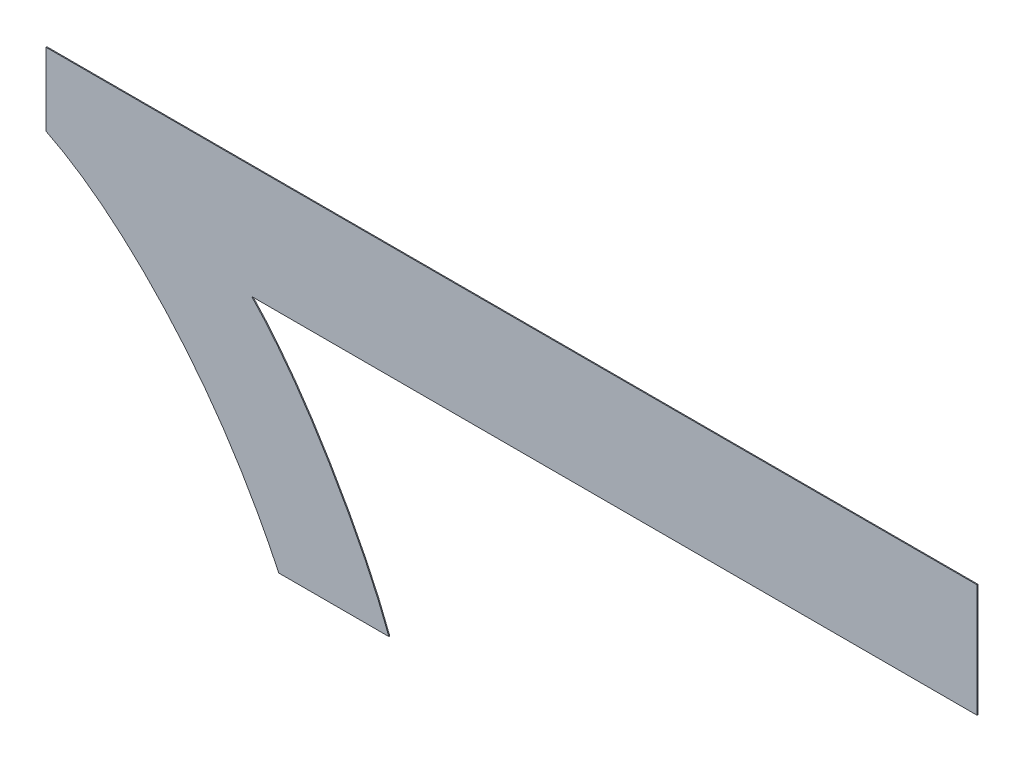
ISO-10303-21;
HEADER;
FILE_DESCRIPTION(('STEP AP214'),'2;1');
FILE_NAME('part.step','',(''),(''),'','','');
FILE_SCHEMA(('AUTOMOTIVE_DESIGN { 1 0 10303 214 1 1 1 1 }'));
ENDSEC;
DATA;
#1=APPLICATION_CONTEXT('core data for automotive mechanical design processes');
#2=APPLICATION_PROTOCOL_DEFINITION('international standard','automotive_design',2000,#1);
#3=PRODUCT_CONTEXT('',#1,'mechanical');
#4=PRODUCT('Part','Part','',(#3));
#5=PRODUCT_RELATED_PRODUCT_CATEGORY('part','',(#4));
#6=PRODUCT_DEFINITION_FORMATION('','',#4);
#7=PRODUCT_DEFINITION_CONTEXT('part definition',#1,'design');
#8=PRODUCT_DEFINITION('design','',#6,#7);
#9=PRODUCT_DEFINITION_SHAPE('','',#8);
#10=(LENGTH_UNIT() NAMED_UNIT(*) SI_UNIT(.MILLI.,.METRE.));
#11=(NAMED_UNIT(*) PLANE_ANGLE_UNIT() SI_UNIT($,.RADIAN.));
#12=(NAMED_UNIT(*) SI_UNIT($,.STERADIAN.) SOLID_ANGLE_UNIT());
#13=UNCERTAINTY_MEASURE_WITH_UNIT(LENGTH_MEASURE(1.E-05),#10,'distance_accuracy_value','');
#14=(GEOMETRIC_REPRESENTATION_CONTEXT(3) GLOBAL_UNCERTAINTY_ASSIGNED_CONTEXT((#13)) GLOBAL_UNIT_ASSIGNED_CONTEXT((#10,
#11,#12)) REPRESENTATION_CONTEXT('',''));
#15=CARTESIAN_POINT('',(0.,0.,0.));
#16=DIRECTION('',(0.,0.,1.));
#17=DIRECTION('',(1.,0.,0.));
#18=AXIS2_PLACEMENT_3D('',#15,#16,#17);
#19=CARTESIAN_POINT('',(25.9,-11.1374624319714,0.002));
#20=DIRECTION('',(-1.,0.,0.));
#21=DIRECTION('',(0.,0.,1.));
#22=AXIS2_PLACEMENT_3D('',#19,#20,#21);
#23=PLANE('',#22);
#24=CARTESIAN_POINT('',(25.9,-11.1374624319714,0.));
#25=CARTESIAN_POINT('',(25.9,-11.0562342620421,0.));
#26=CARTESIAN_POINT('',(25.9,-10.9750060921128,0.));
#27=CARTESIAN_POINT('',(25.9,-10.8937779221834,0.));
#28=B_SPLINE_CURVE_WITH_KNOTS('',3,(#24,#25,#26,#27),.UNSPECIFIED.,.F.,.F.,(4,4),(0.,
0.0450084687644281),.UNSPECIFIED.);
#29=CARTESIAN_POINT('',(25.9,-11.1374624319714,0.));
#30=VERTEX_POINT('',#29);
#31=CARTESIAN_POINT('',(25.9,-10.8937779221834,0.));
#32=VERTEX_POINT('',#31);
#33=EDGE_CURVE('E84',#30,#32,#28,.T.);
#34=ORIENTED_EDGE('',*,*,#33,.T.);
#35=DIRECTION('',(0.,0.,-1.));
#36=VECTOR('',#35,1.);
#37=CARTESIAN_POINT('',(25.9,-10.8937779221834,0.002));
#38=LINE('',#37,#36);
#39=CARTESIAN_POINT('',(25.9,-10.8937779221834,0.002));
#40=VERTEX_POINT('',#39);
#41=EDGE_CURVE('E93',#40,#32,#38,.T.);
#42=ORIENTED_EDGE('',*,*,#41,.F.);
#43=CARTESIAN_POINT('',(25.9,-11.1374624319714,0.002));
#44=CARTESIAN_POINT('',(25.9,-11.0562342620421,0.002));
#45=CARTESIAN_POINT('',(25.9,-10.9750060921128,0.002));
#46=CARTESIAN_POINT('',(25.9,-10.8937779221834,0.002));
#47=B_SPLINE_CURVE_WITH_KNOTS('',3,(#43,#44,#45,#46),.UNSPECIFIED.,.F.,.F.,(4,4),(0.,
0.0450084687644281),.UNSPECIFIED.);
#48=CARTESIAN_POINT('',(25.9,-11.1374624319714,0.002));
#49=VERTEX_POINT('',#48);
#50=EDGE_CURVE('E98',#49,#40,#47,.T.);
#51=ORIENTED_EDGE('',*,*,#50,.F.);
#52=DIRECTION('',(0.,0.,-1.));
#53=VECTOR('',#52,1.);
#54=CARTESIAN_POINT('',(25.9,-11.1374624319714,0.002));
#55=LINE('',#54,#53);
#56=EDGE_CURVE('E90',#49,#30,#55,.T.);
#57=ORIENTED_EDGE('',*,*,#56,.T.);
#58=EDGE_LOOP('',(#34,#42,#51,#57));
#59=FACE_BOUND('',#58,.T.);
#60=ADVANCED_FACE('F17',(#59),#23,.F.);
#61=CARTESIAN_POINT('',(25.9,-10.8937779221834,0.002));
#62=DIRECTION('',(0.,-1.,0.));
#63=DIRECTION('',(1.,0.,0.));
#64=AXIS2_PLACEMENT_3D('',#61,#62,#63);
#65=PLANE('',#64);
#66=CARTESIAN_POINT('',(25.9,-10.8937779221834,0.));
#67=CARTESIAN_POINT('',(25.2306050064797,-10.8937779221834,0.));
#68=CARTESIAN_POINT('',(24.5612100129595,-10.8937779221834,0.));
#69=CARTESIAN_POINT('',(23.8918150194393,-10.8937779221834,0.));
#70=B_SPLINE_CURVE_WITH_KNOTS('',3,(#66,#67,#68,#69),.UNSPECIFIED.,.F.,.F.,(4,4),
(0.0450084687644281,0.415919738747494),.UNSPECIFIED.);
#71=CARTESIAN_POINT('',(23.8918150194393,-10.8937779221834,0.));
#72=VERTEX_POINT('',#71);
#73=EDGE_CURVE('E81',#32,#72,#70,.T.);
#74=ORIENTED_EDGE('',*,*,#73,.T.);
#75=DIRECTION('',(0.,0.,-1.));
#76=VECTOR('',#75,1.);
#77=CARTESIAN_POINT('',(23.8918150194393,-10.8937779221834,0.002));
#78=LINE('',#77,#76);
#79=CARTESIAN_POINT('',(23.8918150194393,-10.8937779221834,0.002));
#80=VERTEX_POINT('',#79);
#81=EDGE_CURVE('E89',#80,#72,#78,.T.);
#82=ORIENTED_EDGE('',*,*,#81,.F.);
#83=CARTESIAN_POINT('',(25.9,-10.8937779221834,0.002));
#84=CARTESIAN_POINT('',(25.2306050064797,-10.8937779221834,0.002));
#85=CARTESIAN_POINT('',(24.5612100129595,-10.8937779221834,0.002));
#86=CARTESIAN_POINT('',(23.8918150194393,-10.8937779221834,0.002));
#87=B_SPLINE_CURVE_WITH_KNOTS('',3,(#83,#84,#85,#86),.UNSPECIFIED.,.F.,.F.,(4,4),
(0.0450084687644281,0.415919738747494),.UNSPECIFIED.);
#88=EDGE_CURVE('E75',#40,#80,#87,.T.);
#89=ORIENTED_EDGE('',*,*,#88,.F.);
#90=ORIENTED_EDGE('',*,*,#41,.T.);
#91=EDGE_LOOP('',(#74,#82,#89,#90));
#92=FACE_BOUND('',#91,.T.);
#93=ADVANCED_FACE('F94',(#92),#65,.F.);
#94=CARTESIAN_POINT('',(23.8918150194393,-10.8937779221834,0.002));
#95=DIRECTION('',(1.,0.,0.));
#96=DIRECTION('',(0.,0.,-1.));
#97=AXIS2_PLACEMENT_3D('',#94,#95,#96);
#98=PLANE('',#97);
#99=CARTESIAN_POINT('',(23.8918150194393,-10.8937779221834,0.));
#100=CARTESIAN_POINT('',(23.8918150194393,-10.9460347115046,0.));
#101=CARTESIAN_POINT('',(23.8918150194393,-10.9982915008258,0.));
#102=CARTESIAN_POINT('',(23.8918150194393,-11.050548290147,0.));
#103=B_SPLINE_CURVE_WITH_KNOTS('',3,(#99,#100,#101,#102),.UNSPECIFIED.,.F.,.F.,(4,4),
(0.415919738747494,0.44487518698465),.UNSPECIFIED.);
#104=CARTESIAN_POINT('',(23.8918150194393,-11.050548290147,0.));
#105=VERTEX_POINT('',#104);
#106=EDGE_CURVE('E86',#72,#105,#103,.T.);
#107=ORIENTED_EDGE('',*,*,#106,.T.);
#108=DIRECTION('',(0.,0.,-1.));
#109=VECTOR('',#108,1.);
#110=CARTESIAN_POINT('',(23.8918150194393,-11.050548290147,0.002));
#111=LINE('',#110,#109);
#112=CARTESIAN_POINT('',(23.8918150194393,-11.050548290147,0.002));
#113=VERTEX_POINT('',#112);
#114=EDGE_CURVE('E145',#113,#105,#111,.T.);
#115=ORIENTED_EDGE('',*,*,#114,.F.);
#116=CARTESIAN_POINT('',(23.8918150194393,-10.8937779221834,0.002));
#117=CARTESIAN_POINT('',(23.8918150194393,-10.9460347115046,0.002));
#118=CARTESIAN_POINT('',(23.8918150194393,-10.9982915008258,0.002));
#119=CARTESIAN_POINT('',(23.8918150194393,-11.050548290147,0.002));
#120=B_SPLINE_CURVE_WITH_KNOTS('',3,(#116,#117,#118,#119),.UNSPECIFIED.,.F.,.F.,(4,4),
(0.415919738747494,0.44487518698465),.UNSPECIFIED.);
#121=EDGE_CURVE('E149',#80,#113,#120,.T.);
#122=ORIENTED_EDGE('',*,*,#121,.F.);
#123=ORIENTED_EDGE('',*,*,#81,.T.);
#124=EDGE_LOOP('',(#107,#115,#122,#123));
#125=FACE_BOUND('',#124,.T.);
#126=ADVANCED_FACE('F199',(#125),#98,.F.);
#127=CARTESIAN_POINT('',(23.8918150194393,-11.050548290147,0.002));
#128=CARTESIAN_POINT('',(23.9781665643544,-11.0931930793599,0.002));
#129=CARTESIAN_POINT('',(24.0673828524657,-11.1650800097474,0.002));
#130=CARTESIAN_POINT('',(24.251159901586,-11.3693470578622,0.002));
#131=CARTESIAN_POINT('',(24.3293022304072,-11.4883681260661,0.002));
#132=CARTESIAN_POINT('',(24.3939635768365,-11.6248314515474,0.002));
#133=B_SPLINE_CURVE_WITH_KNOTS('',3,(#127,#128,#129,#130,#131,#132),.UNSPECIFIED.,.F.,.F.,(4,2,
4),(0.44487518698465,0.508874967384781,0.572607148923639),.UNSPECIFIED.);
#134=DIRECTION('',(0.,0.,-1.));
#135=VECTOR('',#134,1.);
#136=SURFACE_OF_LINEAR_EXTRUSION('',#133,#135);
#137=CARTESIAN_POINT('',(23.8918150194393,-11.050548290147,0.));
#138=CARTESIAN_POINT('',(23.9781665643544,-11.0931930793599,0.));
#139=CARTESIAN_POINT('',(24.0673828524657,-11.1650800097474,0.));
#140=CARTESIAN_POINT('',(24.251159901586,-11.3693470578622,0.));
#141=CARTESIAN_POINT('',(24.3293022304072,-11.4883681260661,0.));
#142=CARTESIAN_POINT('',(24.3939635768365,-11.6248314515474,0.));
#143=B_SPLINE_CURVE_WITH_KNOTS('',3,(#137,#138,#139,#140,#141,#142),.UNSPECIFIED.,.F.,.F.,(4,2,
4),(0.44487518698465,0.508874967384781,0.572607148923639),.UNSPECIFIED.);
#144=CARTESIAN_POINT('',(24.3939635768365,-11.6248314515474,0.));
#145=VERTEX_POINT('',#144);
#146=EDGE_CURVE('E159',#105,#145,#143,.T.);
#147=ORIENTED_EDGE('',*,*,#146,.T.);
#148=DIRECTION('',(0.,0.,-1.));
#149=VECTOR('',#148,1.);
#150=CARTESIAN_POINT('',(24.3939635768365,-11.6248314515474,0.002));
#151=LINE('',#150,#149);
#152=CARTESIAN_POINT('',(24.3939635768365,-11.6248314515474,0.002));
#153=VERTEX_POINT('',#152);
#154=EDGE_CURVE('E169',#153,#145,#151,.T.);
#155=ORIENTED_EDGE('',*,*,#154,.F.);
#156=EDGE_CURVE('E173',#113,#153,#133,.T.);
#157=ORIENTED_EDGE('',*,*,#156,.F.);
#158=ORIENTED_EDGE('',*,*,#114,.T.);
#159=EDGE_LOOP('',(#147,#155,#157,#158));
#160=FACE_BOUND('',#159,.T.);
#161=ADVANCED_FACE('F194',(#160),#136,.F.);
#162=CARTESIAN_POINT('',(24.3939635768365,-11.6248314515474,0.002));
#163=DIRECTION('',(0.,1.,0.));
#164=DIRECTION('',(0.,0.,1.));
#165=AXIS2_PLACEMENT_3D('',#162,#163,#164);
#166=PLANE('',#165);
#167=CARTESIAN_POINT('',(24.3939635768365,-11.6248314515474,0.));
#168=CARTESIAN_POINT('',(24.4730850555896,-11.6248314515474,0.));
#169=CARTESIAN_POINT('',(24.5522065343428,-11.6248314515474,0.));
#170=CARTESIAN_POINT('',(24.631328013096,-11.6248314515474,0.));
#171=B_SPLINE_CURVE_WITH_KNOTS('',3,(#167,#168,#169,#170),.UNSPECIFIED.,.F.,.F.,(4,4),
(0.572607148923639,0.615292865316999),.UNSPECIFIED.);
#172=CARTESIAN_POINT('',(24.631328013096,-11.6248314515474,0.));
#173=VERTEX_POINT('',#172);
#174=EDGE_CURVE('E177',#145,#173,#171,.T.);
#175=ORIENTED_EDGE('',*,*,#174,.T.);
#176=DIRECTION('',(0.,0.,-1.));
#177=VECTOR('',#176,1.);
#178=CARTESIAN_POINT('',(24.631328013096,-11.6248314515474,0.002));
#179=LINE('',#178,#177);
#180=CARTESIAN_POINT('',(24.631328013096,-11.6248314515474,0.002));
#181=VERTEX_POINT('',#180);
#182=EDGE_CURVE('E239',#181,#173,#179,.T.);
#183=ORIENTED_EDGE('',*,*,#182,.F.);
#184=CARTESIAN_POINT('',(24.3939635768365,-11.6248314515474,0.002));
#185=CARTESIAN_POINT('',(24.4730850555896,-11.6248314515474,0.002));
#186=CARTESIAN_POINT('',(24.5522065343428,-11.6248314515474,0.002));
#187=CARTESIAN_POINT('',(24.631328013096,-11.6248314515474,0.002));
#188=B_SPLINE_CURVE_WITH_KNOTS('',3,(#184,#185,#186,#187),.UNSPECIFIED.,.F.,.F.,(4,4),
(0.572607148923639,0.615292865316999),.UNSPECIFIED.);
#189=EDGE_CURVE('E243',#153,#181,#188,.T.);
#190=ORIENTED_EDGE('',*,*,#189,.F.);
#191=ORIENTED_EDGE('',*,*,#154,.T.);
#192=EDGE_LOOP('',(#175,#183,#190,#191));
#193=FACE_BOUND('',#192,.T.);
#194=ADVANCED_FACE('F198',(#193),#166,.F.);
#195=CARTESIAN_POINT('',(24.631328013096,-11.6248314515474,0.002));
#196=CARTESIAN_POINT('',(24.6030898301617,-11.5488831126635,0.002));
#197=CARTESIAN_POINT('',(24.5609371802742,-11.4631873933881,0.002));
#198=CARTESIAN_POINT('',(24.4478059851578,-11.2728131622232,0.002));
#199=CARTESIAN_POINT('',(24.3915080826683,-11.1959467143206,0.002));
#200=CARTESIAN_POINT('',(24.3354409658277,-11.1374624319714,0.002));
#201=B_SPLINE_CURVE_WITH_KNOTS('',3,(#195,#196,#197,#198,#199,#200),.UNSPECIFIED.,.F.,.F.,(4,2,
4),(0.615292865316999,0.666850508808582,0.718571072685259),.UNSPECIFIED.);
#202=DIRECTION('',(0.,0.,-1.));
#203=VECTOR('',#202,1.);
#204=SURFACE_OF_LINEAR_EXTRUSION('',#201,#203);
#205=CARTESIAN_POINT('',(24.631328013096,-11.6248314515474,0.));
#206=CARTESIAN_POINT('',(24.6030898301617,-11.5488831126635,0.));
#207=CARTESIAN_POINT('',(24.5609371802742,-11.4631873933881,0.));
#208=CARTESIAN_POINT('',(24.4478059851578,-11.2728131622232,0.));
#209=CARTESIAN_POINT('',(24.3915080826683,-11.1959467143206,0.));
#210=CARTESIAN_POINT('',(24.3354409658277,-11.1374624319714,0.));
#211=B_SPLINE_CURVE_WITH_KNOTS('',3,(#205,#206,#207,#208,#209,#210),.UNSPECIFIED.,.F.,.F.,(4,2,
4),(0.615292865316999,0.666850508808582,0.718571072685259),.UNSPECIFIED.);
#212=CARTESIAN_POINT('',(24.3354409658277,-11.1374624319714,0.));
#213=VERTEX_POINT('',#212);
#214=EDGE_CURVE('E235',#173,#213,#211,.T.);
#215=ORIENTED_EDGE('',*,*,#214,.T.);
#216=DIRECTION('',(0.,0.,-1.));
#217=VECTOR('',#216,1.);
#218=CARTESIAN_POINT('',(24.3354409658277,-11.1374624319714,0.002));
#219=LINE('',#218,#217);
#220=CARTESIAN_POINT('',(24.3354409658277,-11.1374624319714,0.002));
#221=VERTEX_POINT('',#220);
#222=EDGE_CURVE('E264',#221,#213,#219,.T.);
#223=ORIENTED_EDGE('',*,*,#222,.F.);
#224=EDGE_CURVE('E38',#181,#221,#201,.T.);
#225=ORIENTED_EDGE('',*,*,#224,.F.);
#226=ORIENTED_EDGE('',*,*,#182,.T.);
#227=EDGE_LOOP('',(#215,#223,#225,#226));
#228=FACE_BOUND('',#227,.T.);
#229=ADVANCED_FACE('F204',(#228),#204,.F.);
#230=CARTESIAN_POINT('',(24.3354409658277,-11.1374624319714,0.002));
#231=DIRECTION('',(0.,1.,0.));
#232=DIRECTION('',(-1.,0.,0.));
#233=AXIS2_PLACEMENT_3D('',#230,#231,#232);
#234=PLANE('',#233);
#235=CARTESIAN_POINT('',(24.3354409658277,-11.1374624319714,0.));
#236=CARTESIAN_POINT('',(24.8569606438851,-11.1374624319714,0.));
#237=CARTESIAN_POINT('',(25.3784803219425,-11.1374624319714,0.));
#238=CARTESIAN_POINT('',(25.9,-11.1374624319714,0.));
#239=B_SPLINE_CURVE_WITH_KNOTS('',3,(#235,#236,#237,#238),.UNSPECIFIED.,.F.,.F.,(4,4),
(0.718571072685259,1.),.UNSPECIFIED.);
#240=EDGE_CURVE('E30',#213,#30,#239,.T.);
#241=ORIENTED_EDGE('',*,*,#240,.T.);
#242=ORIENTED_EDGE('',*,*,#56,.F.);
#243=CARTESIAN_POINT('',(24.3354409658277,-11.1374624319714,0.002));
#244=CARTESIAN_POINT('',(24.8569606438851,-11.1374624319714,0.002));
#245=CARTESIAN_POINT('',(25.3784803219425,-11.1374624319714,0.002));
#246=CARTESIAN_POINT('',(25.9,-11.1374624319714,0.002));
#247=B_SPLINE_CURVE_WITH_KNOTS('',3,(#243,#244,#245,#246),.UNSPECIFIED.,.F.,.F.,(4,4),
(0.718571072685259,1.),.UNSPECIFIED.);
#248=EDGE_CURVE('E11',#221,#49,#247,.T.);
#249=ORIENTED_EDGE('',*,*,#248,.F.);
#250=ORIENTED_EDGE('',*,*,#222,.T.);
#251=EDGE_LOOP('',(#241,#242,#249,#250));
#252=FACE_BOUND('',#251,.T.);
#253=ADVANCED_FACE('F208',(#252),#234,.F.);
#254=CARTESIAN_POINT('',(24.1588864010938,-11.2667859930891,0.002));
#255=DIRECTION('',(0.,0.,1.));
#256=DIRECTION('',(1.,0.,0.));
#257=AXIS2_PLACEMENT_3D('',#254,#255,#256);
#258=PLANE('',#257);
#259=ORIENTED_EDGE('',*,*,#50,.T.);
#260=ORIENTED_EDGE('',*,*,#88,.T.);
#261=ORIENTED_EDGE('',*,*,#121,.T.);
#262=ORIENTED_EDGE('',*,*,#156,.T.);
#263=ORIENTED_EDGE('',*,*,#189,.T.);
#264=ORIENTED_EDGE('',*,*,#224,.T.);
#265=ORIENTED_EDGE('',*,*,#248,.T.);
#266=EDGE_LOOP('',(#259,#260,#261,#262,#263,#264,#265));
#267=FACE_BOUND('',#266,.T.);
#268=ADVANCED_FACE('F211',(#267),#258,.T.);
#269=CARTESIAN_POINT('',(24.1588864010938,-11.2667859930891,0.));
#270=DIRECTION('',(0.,0.,1.));
#271=DIRECTION('',(1.,0.,0.));
#272=AXIS2_PLACEMENT_3D('',#269,#270,#271);
#273=PLANE('',#272);
#274=ORIENTED_EDGE('',*,*,#33,.F.);
#275=ORIENTED_EDGE('',*,*,#240,.F.);
#276=ORIENTED_EDGE('',*,*,#214,.F.);
#277=ORIENTED_EDGE('',*,*,#174,.F.);
#278=ORIENTED_EDGE('',*,*,#146,.F.);
#279=ORIENTED_EDGE('',*,*,#106,.F.);
#280=ORIENTED_EDGE('',*,*,#73,.F.);
#281=EDGE_LOOP('',(#274,#275,#276,#277,#278,#279,#280));
#282=FACE_BOUND('',#281,.T.);
#283=ADVANCED_FACE('F19',(#282),#273,.F.);
#284=CLOSED_SHELL('',(#60,#93,#126,#161,#194,#229,#253,#268,#283));
#285=MANIFOLD_SOLID_BREP('B1',#284);
#286=ADVANCED_BREP_SHAPE_REPRESENTATION('',(#18,#285),#14);
#287=SHAPE_DEFINITION_REPRESENTATION(#9,#286);
ENDSEC;
END-ISO-10303-21;
